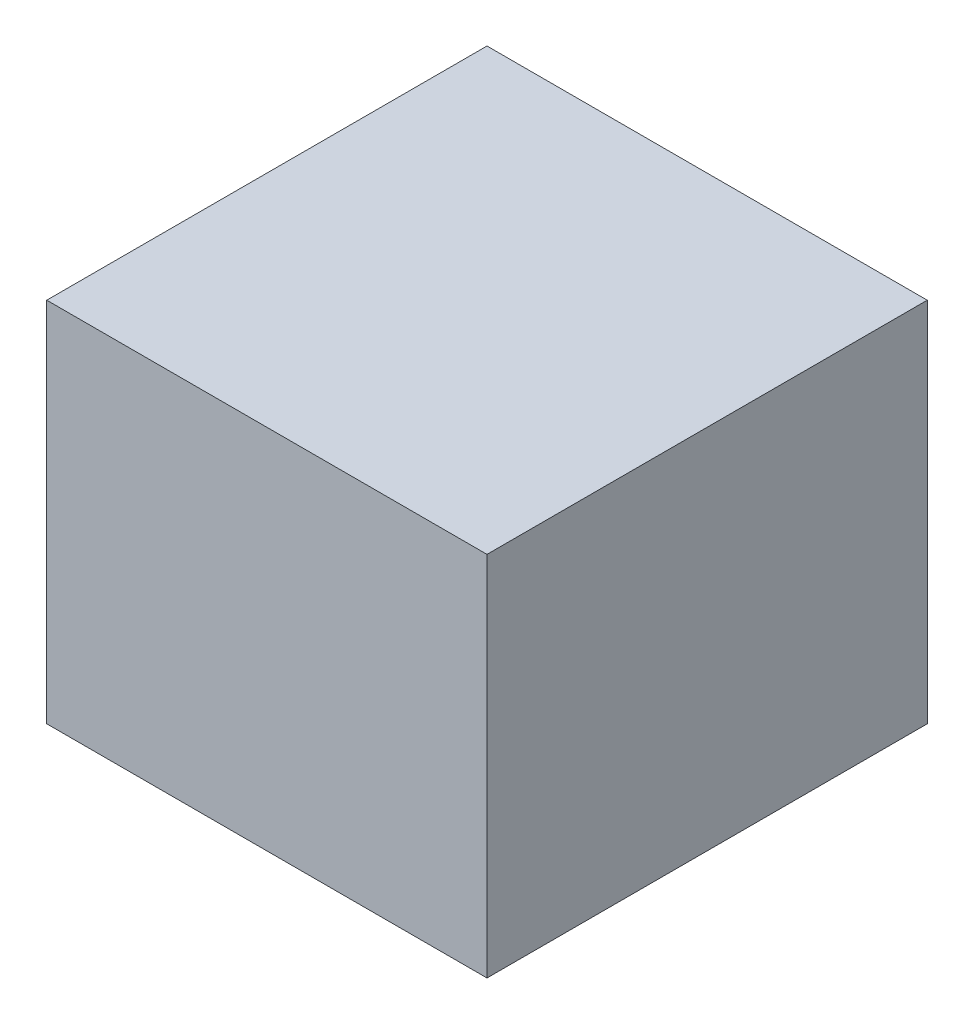
ISO-10303-21;
HEADER;
FILE_DESCRIPTION(('STEP AP214'),'2;1');
FILE_NAME('part.step','',(''),(''),'','','');
FILE_SCHEMA(('AUTOMOTIVE_DESIGN { 1 0 10303 214 1 1 1 1 }'));
ENDSEC;
DATA;
#1=APPLICATION_CONTEXT('core data for automotive mechanical design processes');
#2=APPLICATION_PROTOCOL_DEFINITION('international standard','automotive_design',2000,#1);
#3=PRODUCT_CONTEXT('',#1,'mechanical');
#4=PRODUCT('Part','Part','',(#3));
#5=PRODUCT_RELATED_PRODUCT_CATEGORY('part','',(#4));
#6=PRODUCT_DEFINITION_FORMATION('','',#4);
#7=PRODUCT_DEFINITION_CONTEXT('part definition',#1,'design');
#8=PRODUCT_DEFINITION('design','',#6,#7);
#9=PRODUCT_DEFINITION_SHAPE('','',#8);
#10=(LENGTH_UNIT() NAMED_UNIT(*) SI_UNIT(.MILLI.,.METRE.));
#11=(NAMED_UNIT(*) PLANE_ANGLE_UNIT() SI_UNIT($,.RADIAN.));
#12=(NAMED_UNIT(*) SI_UNIT($,.STERADIAN.) SOLID_ANGLE_UNIT());
#13=UNCERTAINTY_MEASURE_WITH_UNIT(LENGTH_MEASURE(1.E-05),#10,'distance_accuracy_value','');
#14=(GEOMETRIC_REPRESENTATION_CONTEXT(3) GLOBAL_UNCERTAINTY_ASSIGNED_CONTEXT((#13)) GLOBAL_UNIT_ASSIGNED_CONTEXT((#10,
#11,#12)) REPRESENTATION_CONTEXT('',''));
#15=CARTESIAN_POINT('',(0.,0.,0.));
#16=DIRECTION('',(0.,0.,1.));
#17=DIRECTION('',(1.,0.,0.));
#18=AXIS2_PLACEMENT_3D('',#15,#16,#17);
#19=CARTESIAN_POINT('',(-6.,10.,-6.));
#20=DIRECTION('',(1.,0.,0.));
#21=DIRECTION('',(0.,0.,-1.));
#22=AXIS2_PLACEMENT_3D('',#19,#20,#21);
#23=PLANE('',#22);
#24=DIRECTION('',(0.,0.,1.));
#25=VECTOR('',#24,1.);
#26=CARTESIAN_POINT('',(-6.,0.,-6.));
#27=LINE('',#26,#25);
#28=CARTESIAN_POINT('',(-6.,0.,-6.));
#29=VERTEX_POINT('',#28);
#30=CARTESIAN_POINT('',(-6.,0.,6.));
#31=VERTEX_POINT('',#30);
#32=EDGE_CURVE('E104',#29,#31,#27,.T.);
#33=ORIENTED_EDGE('',*,*,#32,.T.);
#34=DIRECTION('',(0.,-1.,0.));
#35=VECTOR('',#34,1.);
#36=CARTESIAN_POINT('',(-6.,10.,6.));
#37=LINE('',#36,#35);
#38=CARTESIAN_POINT('',(-6.,10.,6.));
#39=VERTEX_POINT('',#38);
#40=EDGE_CURVE('E11',#39,#31,#37,.T.);
#41=ORIENTED_EDGE('',*,*,#40,.F.);
#42=DIRECTION('',(0.,0.,1.));
#43=VECTOR('',#42,1.);
#44=CARTESIAN_POINT('',(-6.,10.,-6.));
#45=LINE('',#44,#43);
#46=CARTESIAN_POINT('',(-6.,10.,-6.));
#47=VERTEX_POINT('',#46);
#48=EDGE_CURVE('E92',#47,#39,#45,.T.);
#49=ORIENTED_EDGE('',*,*,#48,.F.);
#50=DIRECTION('',(0.,-1.,0.));
#51=VECTOR('',#50,1.);
#52=CARTESIAN_POINT('',(-6.,10.,-6.));
#53=LINE('',#52,#51);
#54=EDGE_CURVE('E100',#47,#29,#53,.T.);
#55=ORIENTED_EDGE('',*,*,#54,.T.);
#56=EDGE_LOOP('',(#33,#41,#49,#55));
#57=FACE_BOUND('',#56,.T.);
#58=ADVANCED_FACE('F41',(#57),#23,.F.);
#59=CARTESIAN_POINT('',(-6.,10.,6.));
#60=DIRECTION('',(0.,0.,-1.));
#61=DIRECTION('',(-1.,0.,0.));
#62=AXIS2_PLACEMENT_3D('',#59,#60,#61);
#63=PLANE('',#62);
#64=DIRECTION('',(1.,0.,0.));
#65=VECTOR('',#64,1.);
#66=CARTESIAN_POINT('',(-6.,0.,6.));
#67=LINE('',#66,#65);
#68=CARTESIAN_POINT('',(6.,0.,6.));
#69=VERTEX_POINT('',#68);
#70=EDGE_CURVE('E96',#31,#69,#67,.T.);
#71=ORIENTED_EDGE('',*,*,#70,.T.);
#72=DIRECTION('',(0.,-1.,0.));
#73=VECTOR('',#72,1.);
#74=CARTESIAN_POINT('',(6.,10.,6.));
#75=LINE('',#74,#73);
#76=CARTESIAN_POINT('',(6.,10.,6.));
#77=VERTEX_POINT('',#76);
#78=EDGE_CURVE('E49',#77,#69,#75,.T.);
#79=ORIENTED_EDGE('',*,*,#78,.F.);
#80=DIRECTION('',(1.,0.,0.));
#81=VECTOR('',#80,1.);
#82=CARTESIAN_POINT('',(-6.,10.,6.));
#83=LINE('',#82,#81);
#84=EDGE_CURVE('E87',#39,#77,#83,.T.);
#85=ORIENTED_EDGE('',*,*,#84,.F.);
#86=ORIENTED_EDGE('',*,*,#40,.T.);
#87=EDGE_LOOP('',(#71,#79,#85,#86));
#88=FACE_BOUND('',#87,.T.);
#89=ADVANCED_FACE('F95',(#88),#63,.F.);
#90=CARTESIAN_POINT('',(6.,10.,-6.));
#91=DIRECTION('',(-1.,0.,0.));
#92=DIRECTION('',(0.,0.,1.));
#93=AXIS2_PLACEMENT_3D('',#90,#91,#92);
#94=PLANE('',#93);
#95=DIRECTION('',(0.,0.,-1.));
#96=VECTOR('',#95,1.);
#97=CARTESIAN_POINT('',(6.,0.,-6.));
#98=LINE('',#97,#96);
#99=CARTESIAN_POINT('',(6.,0.,-6.));
#100=VERTEX_POINT('',#99);
#101=EDGE_CURVE('E74',#69,#100,#98,.T.);
#102=ORIENTED_EDGE('',*,*,#101,.T.);
#103=DIRECTION('',(0.,-1.,0.));
#104=VECTOR('',#103,1.);
#105=CARTESIAN_POINT('',(6.,10.,-6.));
#106=LINE('',#105,#104);
#107=CARTESIAN_POINT('',(6.,10.,-6.));
#108=VERTEX_POINT('',#107);
#109=EDGE_CURVE('E97',#108,#100,#106,.T.);
#110=ORIENTED_EDGE('',*,*,#109,.F.);
#111=DIRECTION('',(0.,0.,-1.));
#112=VECTOR('',#111,1.);
#113=CARTESIAN_POINT('',(6.,10.,-6.));
#114=LINE('',#113,#112);
#115=EDGE_CURVE('E90',#77,#108,#114,.T.);
#116=ORIENTED_EDGE('',*,*,#115,.F.);
#117=ORIENTED_EDGE('',*,*,#78,.T.);
#118=EDGE_LOOP('',(#102,#110,#116,#117));
#119=FACE_BOUND('',#118,.T.);
#120=ADVANCED_FACE('F98',(#119),#94,.F.);
#121=CARTESIAN_POINT('',(-6.,10.,-6.));
#122=DIRECTION('',(0.,0.,1.));
#123=DIRECTION('',(1.,0.,0.));
#124=AXIS2_PLACEMENT_3D('',#121,#122,#123);
#125=PLANE('',#124);
#126=DIRECTION('',(-1.,0.,0.));
#127=VECTOR('',#126,1.);
#128=CARTESIAN_POINT('',(-6.,0.,-6.));
#129=LINE('',#128,#127);
#130=EDGE_CURVE('E80',#100,#29,#129,.T.);
#131=ORIENTED_EDGE('',*,*,#130,.T.);
#132=ORIENTED_EDGE('',*,*,#54,.F.);
#133=DIRECTION('',(-1.,0.,0.));
#134=VECTOR('',#133,1.);
#135=CARTESIAN_POINT('',(-6.,10.,-6.));
#136=LINE('',#135,#134);
#137=EDGE_CURVE('E57',#108,#47,#136,.T.);
#138=ORIENTED_EDGE('',*,*,#137,.F.);
#139=ORIENTED_EDGE('',*,*,#109,.T.);
#140=EDGE_LOOP('',(#131,#132,#138,#139));
#141=FACE_BOUND('',#140,.T.);
#142=ADVANCED_FACE('F112',(#141),#125,.F.);
#143=CARTESIAN_POINT('',(0.,10.,0.));
#144=DIRECTION('',(0.,1.,0.));
#145=DIRECTION('',(0.,0.,1.));
#146=AXIS2_PLACEMENT_3D('',#143,#144,#145);
#147=PLANE('',#146);
#148=ORIENTED_EDGE('',*,*,#48,.T.);
#149=ORIENTED_EDGE('',*,*,#84,.T.);
#150=ORIENTED_EDGE('',*,*,#115,.T.);
#151=ORIENTED_EDGE('',*,*,#137,.T.);
#152=EDGE_LOOP('',(#148,#149,#150,#151));
#153=FACE_BOUND('',#152,.T.);
#154=ADVANCED_FACE('F88',(#153),#147,.T.);
#155=CARTESIAN_POINT('',(0.,0.,0.));
#156=DIRECTION('',(0.,1.,0.));
#157=DIRECTION('',(0.,0.,1.));
#158=AXIS2_PLACEMENT_3D('',#155,#156,#157);
#159=PLANE('',#158);
#160=CARTESIAN_POINT('',(0.,0.,0.));
#161=DIRECTION('',(0.,-1.,0.));
#162=DIRECTION('',(0.,0.,-1.));
#163=AXIS2_PLACEMENT_3D('',#160,#161,#162);
#164=CIRCLE('',#163,3.);
#165=CARTESIAN_POINT('',(0.,0.,-3.));
#166=VERTEX_POINT('',#165);
#167=EDGE_CURVE('E118',#166,#166,#164,.T.);
#168=ORIENTED_EDGE('',*,*,#167,.F.);
#169=EDGE_LOOP('',(#168));
#170=FACE_BOUND('',#169,.T.);
#171=ORIENTED_EDGE('',*,*,#32,.F.);
#172=ORIENTED_EDGE('',*,*,#130,.F.);
#173=ORIENTED_EDGE('',*,*,#101,.F.);
#174=ORIENTED_EDGE('',*,*,#70,.F.);
#175=EDGE_LOOP('',(#171,#172,#173,#174));
#176=FACE_BOUND('',#175,.T.);
#177=ADVANCED_FACE('F115',(#170,#176),#159,.F.);
#178=CARTESIAN_POINT('',(0.,5.,0.));
#179=DIRECTION('',(0.,-1.,0.));
#180=DIRECTION('',(0.,0.,-1.));
#181=AXIS2_PLACEMENT_3D('',#178,#179,#180);
#182=CYLINDRICAL_SURFACE('',#181,3.);
#183=CARTESIAN_POINT('',(0.,5.,0.));
#184=DIRECTION('',(0.,-1.,0.));
#185=DIRECTION('',(0.,0.,-1.));
#186=AXIS2_PLACEMENT_3D('',#183,#184,#185);
#187=CIRCLE('',#186,3.);
#188=CARTESIAN_POINT('',(0.,5.,-3.));
#189=VERTEX_POINT('',#188);
#190=EDGE_CURVE('E107',#189,#189,#187,.T.);
#191=ORIENTED_EDGE('',*,*,#190,.F.);
#192=EDGE_LOOP('',(#191));
#193=FACE_BOUND('',#192,.T.);
#194=ORIENTED_EDGE('',*,*,#167,.T.);
#195=EDGE_LOOP('',(#194));
#196=FACE_BOUND('',#195,.T.);
#197=ADVANCED_FACE('F126',(#193,#196),#182,.F.);
#198=CARTESIAN_POINT('',(0.,5.,0.));
#199=DIRECTION('',(0.,-1.,0.));
#200=DIRECTION('',(0.,0.,-1.));
#201=AXIS2_PLACEMENT_3D('',#198,#199,#200);
#202=PLANE('',#201);
#203=ORIENTED_EDGE('',*,*,#190,.T.);
#204=EDGE_LOOP('',(#203));
#205=FACE_BOUND('',#204,.T.);
#206=ADVANCED_FACE('F124',(#205),#202,.T.);
#207=CLOSED_SHELL('',(#58,#89,#120,#142,#154,#177,#197,#206));
#208=MANIFOLD_SOLID_BREP('B2',#207);
#209=ADVANCED_BREP_SHAPE_REPRESENTATION('',(#18,#208),#14);
#210=SHAPE_DEFINITION_REPRESENTATION(#9,#209);
ENDSEC;
END-ISO-10303-21;
